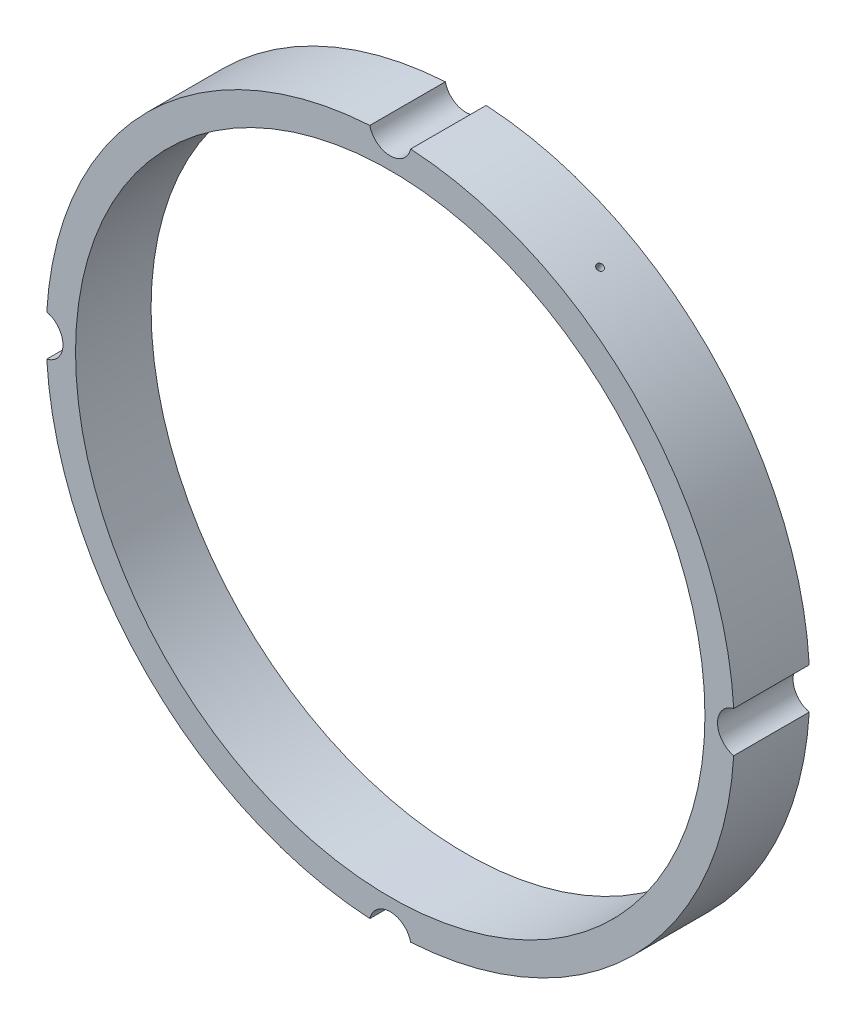
ISO-10303-21;
HEADER;
FILE_DESCRIPTION(('STEP AP214'),'2;1');
FILE_NAME('part.step','',(''),(''),'','','');
FILE_SCHEMA(('AUTOMOTIVE_DESIGN { 1 0 10303 214 1 1 1 1 }'));
ENDSEC;
DATA;
#1=APPLICATION_CONTEXT('core data for automotive mechanical design processes');
#2=APPLICATION_PROTOCOL_DEFINITION('international standard','automotive_design',2000,#1);
#3=PRODUCT_CONTEXT('',#1,'mechanical');
#4=PRODUCT('Part','Part','',(#3));
#5=PRODUCT_RELATED_PRODUCT_CATEGORY('part','',(#4));
#6=PRODUCT_DEFINITION_FORMATION('','',#4);
#7=PRODUCT_DEFINITION_CONTEXT('part definition',#1,'design');
#8=PRODUCT_DEFINITION('design','',#6,#7);
#9=PRODUCT_DEFINITION_SHAPE('','',#8);
#10=(LENGTH_UNIT() NAMED_UNIT(*) SI_UNIT(.MILLI.,.METRE.));
#11=(NAMED_UNIT(*) PLANE_ANGLE_UNIT() SI_UNIT($,.RADIAN.));
#12=(NAMED_UNIT(*) SI_UNIT($,.STERADIAN.) SOLID_ANGLE_UNIT());
#13=UNCERTAINTY_MEASURE_WITH_UNIT(LENGTH_MEASURE(1.E-05),#10,'distance_accuracy_value','');
#14=(GEOMETRIC_REPRESENTATION_CONTEXT(3) GLOBAL_UNCERTAINTY_ASSIGNED_CONTEXT((#13)) GLOBAL_UNIT_ASSIGNED_CONTEXT((#10,
#11,#12)) REPRESENTATION_CONTEXT('',''));
#15=CARTESIAN_POINT('',(0.,0.,0.));
#16=DIRECTION('',(0.,0.,1.));
#17=DIRECTION('',(1.,0.,0.));
#18=AXIS2_PLACEMENT_3D('',#15,#16,#17);
#19=CARTESIAN_POINT('',(0.,0.,18.));
#20=DIRECTION('',(0.,0.,-1.));
#21=DIRECTION('',(-1.,0.,0.));
#22=AXIS2_PLACEMENT_3D('',#19,#20,#21);
#23=CYLINDRICAL_SURFACE('',#22,82.);
#24=CARTESIAN_POINT('',(0.,0.,0.));
#25=DIRECTION('',(0.,0.,1.));
#26=DIRECTION('',(1.,0.,0.));
#27=AXIS2_PLACEMENT_3D('',#24,#25,#26);
#28=CIRCLE('',#27,82.);
#29=CARTESIAN_POINT('',(-4.86723129559619,81.855421686747,0.));
#30=VERTEX_POINT('',#29);
#31=CARTESIAN_POINT('',(-81.8554216867469,4.86723129559705,0.));
#32=VERTEX_POINT('',#31);
#33=EDGE_CURVE('E123',#30,#32,#28,.T.);
#34=ORIENTED_EDGE('',*,*,#33,.T.);
#35=DIRECTION('',(0.,0.,1.));
#36=VECTOR('',#35,1.);
#37=CARTESIAN_POINT('',(-81.8554216867469,4.86723129559704,9.));
#38=LINE('',#37,#36);
#39=CARTESIAN_POINT('',(-81.8554216867469,4.86723129559704,18.));
#40=VERTEX_POINT('',#39);
#41=EDGE_CURVE('E56',#32,#40,#38,.T.);
#42=ORIENTED_EDGE('',*,*,#41,.T.);
#43=CARTESIAN_POINT('',(0.,0.,18.));
#44=DIRECTION('',(0.,0.,1.));
#45=DIRECTION('',(1.,0.,0.));
#46=AXIS2_PLACEMENT_3D('',#43,#44,#45);
#47=CIRCLE('',#46,82.);
#48=CARTESIAN_POINT('',(-4.86723129559619,81.855421686747,18.));
#49=VERTEX_POINT('',#48);
#50=EDGE_CURVE('E130',#49,#40,#47,.T.);
#51=ORIENTED_EDGE('',*,*,#50,.F.);
#52=DIRECTION('',(0.,0.,1.));
#53=VECTOR('',#52,1.);
#54=CARTESIAN_POINT('',(-4.86723129559619,81.855421686747,9.));
#55=LINE('',#54,#53);
#56=EDGE_CURVE('E132',#49,#30,#55,.F.);
#57=ORIENTED_EDGE('',*,*,#56,.T.);
#58=EDGE_LOOP('',(#34,#42,#51,#57));
#59=FACE_BOUND('',#58,.T.);
#60=ADVANCED_FACE('F37',(#59),#23,.T.);
#61=CARTESIAN_POINT('',(-81.8554216867471,-4.86723129559533,18.));
#62=VERTEX_POINT('',#61);
#63=CARTESIAN_POINT('',(-4.86723129559619,-81.855421686747,18.));
#64=VERTEX_POINT('',#63);
#65=EDGE_CURVE('E116',#62,#64,#47,.T.);
#66=ORIENTED_EDGE('',*,*,#65,.F.);
#67=DIRECTION('',(0.,0.,1.));
#68=VECTOR('',#67,1.);
#69=CARTESIAN_POINT('',(-81.8554216867471,-4.86723129559533,9.));
#70=LINE('',#69,#68);
#71=CARTESIAN_POINT('',(-81.8554216867471,-4.86723129559533,0.));
#72=VERTEX_POINT('',#71);
#73=EDGE_CURVE('E107',#62,#72,#70,.F.);
#74=ORIENTED_EDGE('',*,*,#73,.T.);
#75=CARTESIAN_POINT('',(-4.86723129559619,-81.855421686747,0.));
#76=VERTEX_POINT('',#75);
#77=EDGE_CURVE('E64',#72,#76,#28,.T.);
#78=ORIENTED_EDGE('',*,*,#77,.T.);
#79=DIRECTION('',(0.,0.,1.));
#80=VECTOR('',#79,1.);
#81=CARTESIAN_POINT('',(-4.86723129559619,-81.855421686747,9.));
#82=LINE('',#81,#80);
#83=EDGE_CURVE('E161',#76,#64,#82,.T.);
#84=ORIENTED_EDGE('',*,*,#83,.T.);
#85=EDGE_LOOP('',(#66,#74,#78,#84));
#86=FACE_BOUND('',#85,.T.);
#87=ADVANCED_FACE('F115',(#86),#23,.T.);
#88=CARTESIAN_POINT('',(4.86723129559619,-81.855421686747,18.));
#89=VERTEX_POINT('',#88);
#90=CARTESIAN_POINT('',(81.855421686747,-4.86723129559647,18.));
#91=VERTEX_POINT('',#90);
#92=EDGE_CURVE('E146',#89,#91,#47,.T.);
#93=ORIENTED_EDGE('',*,*,#92,.F.);
#94=DIRECTION('',(0.,0.,1.));
#95=VECTOR('',#94,1.);
#96=CARTESIAN_POINT('',(4.86723129559619,-81.855421686747,9.));
#97=LINE('',#96,#95);
#98=CARTESIAN_POINT('',(4.86723129559619,-81.855421686747,0.));
#99=VERTEX_POINT('',#98);
#100=EDGE_CURVE('E214',#89,#99,#97,.F.);
#101=ORIENTED_EDGE('',*,*,#100,.T.);
#102=CARTESIAN_POINT('',(81.855421686747,-4.86723129559647,0.));
#103=VERTEX_POINT('',#102);
#104=EDGE_CURVE('E124',#99,#103,#28,.T.);
#105=ORIENTED_EDGE('',*,*,#104,.T.);
#106=DIRECTION('',(0.,0.,1.));
#107=VECTOR('',#106,1.);
#108=CARTESIAN_POINT('',(81.855421686747,-4.86723129559647,9.));
#109=LINE('',#108,#107);
#110=EDGE_CURVE('E49',#103,#91,#109,.T.);
#111=ORIENTED_EDGE('',*,*,#110,.T.);
#112=EDGE_LOOP('',(#93,#101,#105,#111));
#113=FACE_BOUND('',#112,.T.);
#114=ADVANCED_FACE('F144',(#113),#23,.T.);
#115=CARTESIAN_POINT('',(0.,0.,18.));
#116=DIRECTION('',(0.,0.,1.));
#117=DIRECTION('',(1.,0.,0.));
#118=AXIS2_PLACEMENT_3D('',#115,#116,#117);
#119=PLANE('',#118);
#120=CARTESIAN_POINT('',(-83.,8.6937885337194E-13,18.));
#121=DIRECTION('',(0.,0.,1.));
#122=DIRECTION('',(0.,1.,0.));
#123=AXIS2_PLACEMENT_3D('',#120,#121,#122);
#124=CIRCLE('',#123,5.);
#125=EDGE_CURVE('E112',#62,#40,#124,.T.);
#126=ORIENTED_EDGE('',*,*,#125,.F.);
#127=ORIENTED_EDGE('',*,*,#65,.T.);
#128=CARTESIAN_POINT('',(0.,-83.,18.));
#129=DIRECTION('',(0.,0.,1.));
#130=DIRECTION('',(-1.,0.,0.));
#131=AXIS2_PLACEMENT_3D('',#128,#129,#130);
#132=CIRCLE('',#131,5.);
#133=EDGE_CURVE('E206',#89,#64,#132,.T.);
#134=ORIENTED_EDGE('',*,*,#133,.F.);
#135=ORIENTED_EDGE('',*,*,#92,.T.);
#136=CARTESIAN_POINT('',(83.,-2.8979295112398E-13,18.));
#137=DIRECTION('',(0.,0.,1.));
#138=DIRECTION('',(0.,-1.,0.));
#139=AXIS2_PLACEMENT_3D('',#136,#137,#138);
#140=CIRCLE('',#139,5.);
#141=CARTESIAN_POINT('',(81.855421686747,4.8672312955959,18.));
#142=VERTEX_POINT('',#141);
#143=EDGE_CURVE('E153',#142,#91,#140,.T.);
#144=ORIENTED_EDGE('',*,*,#143,.F.);
#145=CARTESIAN_POINT('',(4.86723129559619,81.855421686747,18.));
#146=VERTEX_POINT('',#145);
#147=EDGE_CURVE('E126',#142,#146,#47,.T.);
#148=ORIENTED_EDGE('',*,*,#147,.T.);
#149=CARTESIAN_POINT('',(0.,83.,18.));
#150=DIRECTION('',(0.,0.,1.));
#151=DIRECTION('',(1.,0.,0.));
#152=AXIS2_PLACEMENT_3D('',#149,#150,#151);
#153=CIRCLE('',#152,5.);
#154=EDGE_CURVE('E156',#49,#146,#153,.T.);
#155=ORIENTED_EDGE('',*,*,#154,.F.);
#156=ORIENTED_EDGE('',*,*,#50,.T.);
#157=EDGE_LOOP('',(#126,#127,#134,#135,#144,#148,#155,#156));
#158=FACE_BOUND('',#157,.T.);
#159=CARTESIAN_POINT('',(0.,0.,18.));
#160=DIRECTION('',(0.,0.,1.));
#161=DIRECTION('',(1.,0.,0.));
#162=AXIS2_PLACEMENT_3D('',#159,#160,#161);
#163=CIRCLE('',#162,75.);
#164=CARTESIAN_POINT('',(75.,0.,18.));
#165=VERTEX_POINT('',#164);
#166=EDGE_CURVE('E168',#165,#165,#163,.T.);
#167=ORIENTED_EDGE('',*,*,#166,.F.);
#168=EDGE_LOOP('',(#167));
#169=FACE_BOUND('',#168,.T.);
#170=ADVANCED_FACE('F202',(#158,#169),#119,.T.);
#171=CARTESIAN_POINT('',(0.,0.,0.));
#172=DIRECTION('',(0.,0.,1.));
#173=DIRECTION('',(1.,0.,0.));
#174=AXIS2_PLACEMENT_3D('',#171,#172,#173);
#175=PLANE('',#174);
#176=ORIENTED_EDGE('',*,*,#77,.F.);
#177=CARTESIAN_POINT('',(-83.,8.6937885337194E-13,0.));
#178=DIRECTION('',(0.,0.,1.));
#179=DIRECTION('',(0.,1.,0.));
#180=AXIS2_PLACEMENT_3D('',#177,#178,#179);
#181=CIRCLE('',#180,5.);
#182=EDGE_CURVE('E105',#72,#32,#181,.T.);
#183=ORIENTED_EDGE('',*,*,#182,.T.);
#184=ORIENTED_EDGE('',*,*,#33,.F.);
#185=CARTESIAN_POINT('',(0.,83.,0.));
#186=DIRECTION('',(0.,0.,1.));
#187=DIRECTION('',(1.,0.,0.));
#188=AXIS2_PLACEMENT_3D('',#185,#186,#187);
#189=CIRCLE('',#188,5.);
#190=CARTESIAN_POINT('',(4.86723129559619,81.855421686747,0.));
#191=VERTEX_POINT('',#190);
#192=EDGE_CURVE('E159',#30,#191,#189,.T.);
#193=ORIENTED_EDGE('',*,*,#192,.T.);
#194=CARTESIAN_POINT('',(81.855421686747,4.8672312955959,0.));
#195=VERTEX_POINT('',#194);
#196=EDGE_CURVE('E127',#195,#191,#28,.T.);
#197=ORIENTED_EDGE('',*,*,#196,.F.);
#198=CARTESIAN_POINT('',(83.,-2.8979295112398E-13,0.));
#199=DIRECTION('',(0.,0.,1.));
#200=DIRECTION('',(0.,-1.,0.));
#201=AXIS2_PLACEMENT_3D('',#198,#199,#200);
#202=CIRCLE('',#201,5.);
#203=EDGE_CURVE('E151',#195,#103,#202,.T.);
#204=ORIENTED_EDGE('',*,*,#203,.T.);
#205=ORIENTED_EDGE('',*,*,#104,.F.);
#206=CARTESIAN_POINT('',(0.,-83.,0.));
#207=DIRECTION('',(0.,0.,1.));
#208=DIRECTION('',(-1.,0.,0.));
#209=AXIS2_PLACEMENT_3D('',#206,#207,#208);
#210=CIRCLE('',#209,5.);
#211=EDGE_CURVE('E122',#99,#76,#210,.T.);
#212=ORIENTED_EDGE('',*,*,#211,.T.);
#213=EDGE_LOOP('',(#176,#183,#184,#193,#197,#204,#205,#212));
#214=FACE_BOUND('',#213,.T.);
#215=CARTESIAN_POINT('',(0.,0.,0.));
#216=DIRECTION('',(0.,0.,1.));
#217=DIRECTION('',(1.,0.,0.));
#218=AXIS2_PLACEMENT_3D('',#215,#216,#217);
#219=CIRCLE('',#218,75.);
#220=CARTESIAN_POINT('',(75.,0.,0.));
#221=VERTEX_POINT('',#220);
#222=EDGE_CURVE('E166',#221,#221,#219,.T.);
#223=ORIENTED_EDGE('',*,*,#222,.T.);
#224=EDGE_LOOP('',(#223));
#225=FACE_BOUND('',#224,.T.);
#226=ADVANCED_FACE('F119',(#214,#225),#175,.F.);
#227=CARTESIAN_POINT('',(40.3052284110281,71.4107034185693,9.));
#228=CARTESIAN_POINT('',(40.305230162785,71.4107024681233,8.95506479609301));
#229=CARTESIAN_POINT('',(40.3085368078791,71.40883642493,8.91009703714874));
#230=CARTESIAN_POINT('',(40.3216802135916,71.4014156688339,8.82140003350558));
#231=CARTESIAN_POINT('',(40.3315248278901,71.3958565196163,8.7776723443821));
#232=CARTESIAN_POINT('',(40.3574592527584,71.3811999286591,8.69275330768963));
#233=CARTESIAN_POINT('',(40.3735460727166,71.3721041812829,8.65156075648079));
#234=CARTESIAN_POINT('',(40.4114971299767,71.3506227921757,8.57287429083478));
#235=CARTESIAN_POINT('',(40.4333599334488,71.3382379669211,8.53537946164327));
#236=CARTESIAN_POINT('',(40.4822388609424,71.3105120161913,8.4651344354136));
#237=CARTESIAN_POINT('',(40.5092556770344,71.2951704936937,8.43238487660122));
#238=CARTESIAN_POINT('',(40.5676657214676,71.2619507473826,8.37256517048709));
#239=CARTESIAN_POINT('',(40.59905912185,71.2440724238483,8.34549524655357));
#240=CARTESIAN_POINT('',(40.6653214679689,71.2062713712898,8.29780471692709));
#241=CARTESIAN_POINT('',(40.7001904182244,71.1863486396075,8.27718411961991));
#242=CARTESIAN_POINT('',(40.772406334745,71.1450111456782,8.24297779787522));
#243=CARTESIAN_POINT('',(40.8097532955037,71.1235963867468,8.22939205780614));
#244=CARTESIAN_POINT('',(40.8858585322044,71.0798740635081,8.20964144378451));
#245=CARTESIAN_POINT('',(40.9246167652487,71.0575665263361,8.20347634446412));
#246=CARTESIAN_POINT('',(41.0024427076472,71.0126869615936,8.19874133559804));
#247=CARTESIAN_POINT('',(41.0415104163721,70.9901149345609,8.20017141060814));
#248=CARTESIAN_POINT('',(41.1188455717403,70.945348935138,8.21058592631372));
#249=CARTESIAN_POINT('',(41.1571130452983,70.9231549500377,8.21957011251892));
#250=CARTESIAN_POINT('',(41.2317665366884,70.8797805669154,8.2448374350582));
#251=CARTESIAN_POINT('',(41.2681525523058,70.8586001700864,8.26112057998316));
#252=CARTESIAN_POINT('',(41.3380172194721,70.8178647619419,8.30052388209611));
#253=CARTESIAN_POINT('',(41.3714958216182,70.7983097782456,8.32364415543102));
#254=CARTESIAN_POINT('',(41.434603016724,70.7613949232539,8.37606530348475));
#255=CARTESIAN_POINT('',(41.4642316101463,70.7440350516948,8.40536617746083));
#256=CARTESIAN_POINT('',(41.5188083007378,70.7120185025764,8.4693182281911));
#257=CARTESIAN_POINT('',(41.5437562021976,70.6973619380483,8.50396962855131));
#258=CARTESIAN_POINT('',(41.5882710512857,70.6711849340483,8.57763829735254));
#259=CARTESIAN_POINT('',(41.6078379981956,70.6596644949952,8.61665556637643));
#260=CARTESIAN_POINT('',(41.641043626485,70.640100926749,8.69794850712354));
#261=CARTESIAN_POINT('',(41.6546823022913,70.6320578008251,8.74022418191001));
#262=CARTESIAN_POINT('',(41.6756502729947,70.6196879331484,8.8268337992777));
#263=CARTESIAN_POINT('',(41.6829795699621,70.6153611901761,8.87116774118354));
#264=CARTESIAN_POINT('',(41.6911239668386,70.6105530728755,8.96063342804992));
#265=CARTESIAN_POINT('',(41.6919393353669,70.6100715399797,9.00576514003536));
#266=CARTESIAN_POINT('',(41.6870338226723,70.6129677812092,9.09554693556317));
#267=CARTESIAN_POINT('',(41.6813129419862,70.6163455550177,9.14019701914508));
#268=CARTESIAN_POINT('',(41.6634948178797,70.6268596602105,9.22774720890134));
#269=CARTESIAN_POINT('',(41.6513976958952,70.6339959200141,9.27064734838672));
#270=CARTESIAN_POINT('',(41.6211650638207,70.6518147314161,9.3534808607507));
#271=CARTESIAN_POINT('',(41.6030295531477,70.6624972833568,9.39341423334282));
#272=CARTESIAN_POINT('',(41.5612265203059,70.6870924286367,9.46918206255699));
#273=CARTESIAN_POINT('',(41.537558817141,70.7010051276562,9.50501638501377));
#274=CARTESIAN_POINT('',(41.4853544455829,70.7316497769729,9.57156755198845));
#275=CARTESIAN_POINT('',(41.4568177741148,70.7483817290505,9.60228439327472));
#276=CARTESIAN_POINT('',(41.3956750206665,70.7841743762166,9.65772966893016));
#277=CARTESIAN_POINT('',(41.3630688010143,70.8032351500882,9.68245790062276));
#278=CARTESIAN_POINT('',(41.2947046718655,70.8431290267123,9.72522259144113));
#279=CARTESIAN_POINT('',(41.2589467660966,70.8639621273686,9.74325905848161));
#280=CARTESIAN_POINT('',(41.1852880913143,70.9067969831621,9.77212789441348));
#281=CARTESIAN_POINT('',(41.1473873619883,70.9287987166545,9.7829603966825));
#282=CARTESIAN_POINT('',(41.0705139344065,70.9733390629306,9.79711425167829));
#283=CARTESIAN_POINT('',(41.0315412345227,70.9958776765296,9.80043559299621));
#284=CARTESIAN_POINT('',(40.9536306752187,71.0408485140235,9.79947279646204));
#285=CARTESIAN_POINT('',(40.9146928143604,71.0632807424909,9.7951889885238));
#286=CARTESIAN_POINT('',(40.8379572703114,71.1074061241529,9.779138152379));
#287=CARTESIAN_POINT('',(40.8001595894107,71.129099275863,9.76737110914375));
#288=CARTESIAN_POINT('',(40.7267814451327,71.1711392536284,9.73668763250791));
#289=CARTESIAN_POINT('',(40.6912010228659,71.1914860547211,9.71777106659268));
#290=CARTESIAN_POINT('',(40.6232765406942,71.2302669838026,9.67332635454546));
#291=CARTESIAN_POINT('',(40.5909323548439,71.2487011862253,9.64779846584659));
#292=CARTESIAN_POINT('',(40.5304074104666,71.2831487094411,9.59085755066491));
#293=CARTESIAN_POINT('',(40.5022263893502,71.2991621829217,9.55944489564427));
#294=CARTESIAN_POINT('',(40.4508278504761,71.328335198352,9.49161477008843));
#295=CARTESIAN_POINT('',(40.4276115676375,71.3414940302556,9.45519605804872));
#296=CARTESIAN_POINT('',(40.3868099222115,71.3646000206399,9.37838044791628));
#297=CARTESIAN_POINT('',(40.3692273551643,71.3745455846659,9.33798158776967));
#298=CARTESIAN_POINT('',(40.340231691055,71.3909377104108,9.25439747070503));
#299=CARTESIAN_POINT('',(40.3288112020707,71.3973884644812,9.21121562216788));
#300=CARTESIAN_POINT('',(40.3155112248783,71.4048988976244,9.13979902324665));
#301=CARTESIAN_POINT('',(40.3116600520628,71.4070729879977,9.11202827082364));
#302=CARTESIAN_POINT('',(40.3065180975612,71.4099755455663,9.05617592082971));
#303=CARTESIAN_POINT('',(40.3052273157971,71.4107040128057,9.02809432326828));
#304=CARTESIAN_POINT('',(40.3052284110281,71.4107034185693,9.));
#305=B_SPLINE_CURVE_WITH_KNOTS('',3,(#227,#228,#229,#230,#231,#232,#233,#234,#235,#236,#237,
#238,#239,#240,#241,#242,#243,#244,#245,#246,#247,#248,#249,#250,#251,#252,#253,#254,#255,#256,
#257,#258,#259,#260,#261,#262,#263,#264,#265,#266,#267,#268,#269,#270,#271,#272,#273,#274,#275,
#276,#277,#278,#279,#280,#281,#282,#283,#284,#285,#286,#287,#288,#289,#290,#291,#292,#293,#294,
#295,#296,#297,#298,#299,#300,#301,#302,#303,#304),.UNSPECIFIED.,.T.,.F.,(4,2,2,2,2,2,2,2,2,2,2,
2,2,2,2,2,2,2,2,2,2,2,2,2,2,2,2,2,2,2,2,2,2,2,2,2,2,2,4),(0.,0.134703067123949,
0.269568238553243,0.404368876326958,0.539136082591844,0.673921397882173,0.808712013005295,
0.94350280339,1.07829329426615,1.21307969139774,1.3478658144514,1.4826473968801,
1.61742913794746,1.75221316877516,1.88699718340582,2.02178683237555,2.15657649934034,
2.29136629302324,2.426156042478,2.56094023348925,2.69572441343266,2.83050602649563,
2.9652876525739,3.10007368890393,3.23485981034963,3.36965049281604,3.50444101585779,
3.639229043254,3.77401727538222,3.90879966049609,4.04358231629638,4.17836747038269,
4.31314737696436,4.44791877874286,4.58272366439784,4.71759533917825,4.85230486249334,
4.93652372208243,5.02074257910246),.UNSPECIFIED.);
#306=CARTESIAN_POINT('',(40.3052284110281,71.4107034185693,9.));
#307=VERTEX_POINT('',#306);
#308=EDGE_CURVE('E11',#307,#307,#305,.T.);
#309=ORIENTED_EDGE('',*,*,#308,.T.);
#310=EDGE_LOOP('',(#309));
#311=FACE_BOUND('',#310,.T.);
#312=ORIENTED_EDGE('',*,*,#147,.F.);
#313=DIRECTION('',(0.,0.,1.));
#314=VECTOR('',#313,1.);
#315=CARTESIAN_POINT('',(81.855421686747,4.8672312955959,9.));
#316=LINE('',#315,#314);
#317=EDGE_CURVE('E138',#142,#195,#316,.F.);
#318=ORIENTED_EDGE('',*,*,#317,.T.);
#319=ORIENTED_EDGE('',*,*,#196,.T.);
#320=DIRECTION('',(0.,0.,1.));
#321=VECTOR('',#320,1.);
#322=CARTESIAN_POINT('',(4.86723129559619,81.855421686747,9.));
#323=LINE('',#322,#321);
#324=EDGE_CURVE('E135',#191,#146,#323,.T.);
#325=ORIENTED_EDGE('',*,*,#324,.T.);
#326=EDGE_LOOP('',(#312,#318,#319,#325));
#327=FACE_BOUND('',#326,.T.);
#328=ADVANCED_FACE('F39',(#311,#327),#23,.T.);
#329=CARTESIAN_POINT('',(0.,0.,18.));
#330=DIRECTION('',(0.,0.,-1.));
#331=DIRECTION('',(-1.,0.,0.));
#332=AXIS2_PLACEMENT_3D('',#329,#330,#331);
#333=CYLINDRICAL_SURFACE('',#332,75.);
#334=CARTESIAN_POINT('',(36.8050462829542,65.3482101370007,9.));
#335=CARTESIAN_POINT('',(36.8050480371068,65.3482091908556,8.9550650202504));
#336=CARTESIAN_POINT('',(36.8083563893281,65.3463461799556,8.91009749094246));
#337=CARTESIAN_POINT('',(36.8215064307599,65.3389372344705,8.82140095562176));
#338=CARTESIAN_POINT('',(36.8313559762903,65.3333868711768,8.77767350494019));
#339=CARTESIAN_POINT('',(36.8573029001601,65.3187526175866,8.69275494634586));
#340=CARTESIAN_POINT('',(36.8733972851322,65.3096704202157,8.65156263419737));
#341=CARTESIAN_POINT('',(36.9113652327449,65.2882193796654,8.57287659923403));
#342=CARTESIAN_POINT('',(36.9332373616623,65.275851351847,8.535381962022));
#343=CARTESIAN_POINT('',(36.9821357786632,65.2481602840425,8.46513702906338));
#344=CARTESIAN_POINT('',(37.0091627888349,65.2328368300614,8.43238739912278));
#345=CARTESIAN_POINT('',(37.0675928290538,65.1996525164563,8.37256749931847));
#346=CARTESIAN_POINT('',(37.0989960311762,65.1817915570551,8.34549745288538));
#347=CARTESIAN_POINT('',(37.165276621277,65.1440224914367,8.29780653018475));
#348=CARTESIAN_POINT('',(37.2001540272983,65.1241143745878,8.27718568741294));
#349=CARTESIAN_POINT('',(37.2723844475244,65.0828017747338,8.24297889347224));
#350=CARTESIAN_POINT('',(37.309737456126,65.0613972951156,8.22939292638149));
#351=CARTESIAN_POINT('',(37.3858514560471,65.0176901750221,8.20964196631049));
#352=CARTESIAN_POINT('',(37.4246123956757,64.9953875675174,8.20347670116969));
#353=CARTESIAN_POINT('',(37.5024403148383,64.9505118372576,8.19874132894007));
#354=CARTESIAN_POINT('',(37.541507293736,64.9279387150649,8.20017120606366));
#355=CARTESIAN_POINT('',(37.6188373554944,64.8831647861721,8.21058526118988));
#356=CARTESIAN_POINT('',(37.6571004707224,64.8609639644887,8.21956913443268));
#357=CARTESIAN_POINT('',(37.7317423544195,64.8175707954564,8.24483569725782));
#358=CARTESIAN_POINT('',(37.7681211206258,64.7963784493184,8.26111839560382));
#359=CARTESIAN_POINT('',(37.8379693340923,64.7556153066755,8.30052074156641));
#360=CARTESIAN_POINT('',(37.8714387220741,64.7360445432105,8.32364052844562));
#361=CARTESIAN_POINT('',(37.934526459754,64.6990961367939,8.37606063773741));
#362=CARTESIAN_POINT('',(37.9641448097006,64.6817184937006,8.40536095975093));
#363=CARTESIAN_POINT('',(38.0187013917973,64.6496662631315,8.46931214094039));
#364=CARTESIAN_POINT('',(38.0436393901331,64.6349918106984,8.50396326726653));
#365=CARTESIAN_POINT('',(38.0881356631969,64.6087810653332,8.57763147675293));
#366=CARTESIAN_POINT('',(38.1076939372037,64.597244772822,8.61664856049856));
#367=CARTESIAN_POINT('',(38.1408844541449,64.5776533045459,8.69794124937334));
#368=CARTESIAN_POINT('',(38.1545166903565,64.5695981327303,8.74021685819908));
#369=CARTESIAN_POINT('',(38.1754747513236,64.5572093338679,8.82682645392058));
#370=CARTESIAN_POINT('',(38.1828005784973,64.5528757053942,8.87116044002704));
#371=CARTESIAN_POINT('',(38.1909413824111,64.5480597632868,8.96062594210085));
#372=CARTESIAN_POINT('',(38.1917566800836,64.5475772598144,9.00575741864649));
#373=CARTESIAN_POINT('',(38.1868545475179,64.5504775161813,9.09553881341012));
#374=CARTESIAN_POINT('',(38.1811371179785,64.5538602756073,9.14018873167963));
#375=CARTESIAN_POINT('',(38.1633291083601,64.5643896994272,9.22773849669129));
#376=CARTESIAN_POINT('',(38.1512386734367,64.5715362780939,9.27063838326933));
#377=CARTESIAN_POINT('',(38.121021943817,64.58937987047,9.35347150366394));
#378=CARTESIAN_POINT('',(38.1028956482698,64.6000768846797,9.39340473706235));
#379=CARTESIAN_POINT('',(38.0611124544012,64.6247035165116,9.46917268708774));
#380=CARTESIAN_POINT('',(38.0374553396379,64.6386332606425,9.50500724323626));
#381=CARTESIAN_POINT('',(37.9852724588776,64.6693125821188,9.57155900623288));
#382=CARTESIAN_POINT('',(37.9567466895903,64.6860621613697,9.60227620962269));
#383=CARTESIAN_POINT('',(37.8956246465006,64.7218887639564,9.6577225312695));
#384=CARTESIAN_POINT('',(37.863028208343,64.7409658812668,9.6824514076266));
#385=CARTESIAN_POINT('',(37.7946816007971,64.7808892105927,9.72521742401462));
#386=CARTESIAN_POINT('',(37.7589314352171,64.8017354204719,9.7432545721263));
#387=CARTESIAN_POINT('',(37.6852854659991,64.8445917012878,9.77212471767835));
#388=CARTESIAN_POINT('',(37.6473897097049,64.8666017465431,9.78295787401225));
#389=CARTESIAN_POINT('',(37.570522798859,64.9111530416104,9.79711304961451));
#390=CARTESIAN_POINT('',(37.5315516427333,64.9336942922,9.80043505788946));
#391=CARTESIAN_POINT('',(37.4536409057876,64.9786642363913,9.79947358692461));
#392=CARTESIAN_POINT('',(37.4147013234452,65.0010929357281,9.79519049922343));
#393=CARTESIAN_POINT('',(37.3379589704716,65.0452056620496,9.77914120179627));
#394=CARTESIAN_POINT('',(37.3001562021231,65.0668896875391,9.76737497704568));
#395=CARTESIAN_POINT('',(37.2267650922114,65.1089068431069,9.73669322600969));
#396=CARTESIAN_POINT('',(37.1911767916611,65.1292399481661,9.71777756735918));
#397=CARTESIAN_POINT('',(37.1232346218809,65.1679904761977,9.67333473728467));
#398=CARTESIAN_POINT('',(37.0908806269882,65.1864079735984,9.64780782286669));
#399=CARTESIAN_POINT('',(37.0303349483126,65.2208211267837,9.59086865031062));
#400=CARTESIAN_POINT('',(37.0021430357465,65.236816915687,9.55945671587822));
#401=CARTESIAN_POINT('',(36.9507230753817,65.2659554454819,9.49162792346797));
#402=CARTESIAN_POINT('',(36.9274962624952,65.2790974766038,9.45520982405611));
#403=CARTESIAN_POINT('',(36.886674973326,65.3021727146869,9.37839515111328));
#404=CARTESIAN_POINT('',(36.8690833131314,65.3121043173042,9.3379966015531));
#405=CARTESIAN_POINT('',(36.8400719807352,65.3284729390554,9.25441290469288));
#406=CARTESIAN_POINT('',(36.8286449144051,65.3349141447912,9.21123116563502));
#407=CARTESIAN_POINT('',(36.8153363830033,65.3424137824977,9.13981210935175));
#408=CARTESIAN_POINT('',(36.8114824882576,65.3445848245014,9.11203879602761));
#409=CARTESIAN_POINT('',(36.8063368898609,65.3474832975298,9.05618123049376));
#410=CARTESIAN_POINT('',(36.8050451861163,65.3482107286071,9.02809697829541));
#411=CARTESIAN_POINT('',(36.8050462829542,65.3482101370007,9.));
#412=B_SPLINE_CURVE_WITH_KNOTS('',3,(#334,#335,#336,#337,#338,#339,#340,#341,#342,#343,#344,
#345,#346,#347,#348,#349,#350,#351,#352,#353,#354,#355,#356,#357,#358,#359,#360,#361,#362,#363,
#364,#365,#366,#367,#368,#369,#370,#371,#372,#373,#374,#375,#376,#377,#378,#379,#380,#381,#382,
#383,#384,#385,#386,#387,#388,#389,#390,#391,#392,#393,#394,#395,#396,#397,#398,#399,#400,#401,
#402,#403,#404,#405,#406,#407,#408,#409,#410,#411),.UNSPECIFIED.,.T.,.F.,(4,2,2,2,2,2,2,2,2,2,2,
2,2,2,2,2,2,2,2,2,2,2,2,2,2,2,2,2,2,2,2,2,2,2,2,2,2,2,4),(0.,0.134702384884244,
0.269566847771312,0.40436674516063,0.539133223883879,0.673918594382309,0.808709266243901,
0.943500638166865,1.07829170501872,1.21307782814302,1.34786367109516,1.48264407648282,
1.61742464370115,1.7522079564138,1.88699126042393,2.02178129595247,2.15657134955318,
2.29136155606753,2.42615171089689,2.56093522128892,2.69571871726381,2.83049914345483,
2.96527958864289,3.10006530918112,3.2348511208066,3.36964237622914,3.50443346888079,
3.63922158843893,3.7740099052748,3.9087912829084,4.04357293115624,4.17835707488293,
4.31313597979599,4.44790747336683,4.58271244820657,4.71758468521552,4.8522947878496,
4.93652160053771,5.02074841015293),.UNSPECIFIED.);
#413=CARTESIAN_POINT('',(36.8050462829542,65.3482101370007,9.));
#414=VERTEX_POINT('',#413);
#415=EDGE_CURVE('E207',#414,#414,#412,.T.);
#416=ORIENTED_EDGE('',*,*,#415,.F.);
#417=EDGE_LOOP('',(#416));
#418=FACE_BOUND('',#417,.T.);
#419=ORIENTED_EDGE('',*,*,#166,.T.);
#420=EDGE_LOOP('',(#419));
#421=FACE_BOUND('',#420,.T.);
#422=ORIENTED_EDGE('',*,*,#222,.F.);
#423=EDGE_LOOP('',(#422));
#424=FACE_BOUND('',#423,.T.);
#425=ADVANCED_FACE('F173',(#418,#421,#424),#333,.F.);
#426=CARTESIAN_POINT('',(0.,83.,0.));
#427=DIRECTION('',(0.,0.,1.));
#428=DIRECTION('',(1.,0.,0.));
#429=AXIS2_PLACEMENT_3D('',#426,#427,#428);
#430=CYLINDRICAL_SURFACE('',#429,5.);
#431=ORIENTED_EDGE('',*,*,#192,.F.);
#432=ORIENTED_EDGE('',*,*,#56,.F.);
#433=ORIENTED_EDGE('',*,*,#154,.T.);
#434=ORIENTED_EDGE('',*,*,#324,.F.);
#435=EDGE_LOOP('',(#431,#432,#433,#434));
#436=FACE_BOUND('',#435,.T.);
#437=ADVANCED_FACE('F175',(#436),#430,.F.);
#438=CARTESIAN_POINT('',(83.,-2.8979295112398E-13,0.));
#439=DIRECTION('',(0.,0.,1.));
#440=DIRECTION('',(1.,0.,0.));
#441=AXIS2_PLACEMENT_3D('',#438,#439,#440);
#442=CYLINDRICAL_SURFACE('',#441,5.);
#443=ORIENTED_EDGE('',*,*,#203,.F.);
#444=ORIENTED_EDGE('',*,*,#317,.F.);
#445=ORIENTED_EDGE('',*,*,#143,.T.);
#446=ORIENTED_EDGE('',*,*,#110,.F.);
#447=EDGE_LOOP('',(#443,#444,#445,#446));
#448=FACE_BOUND('',#447,.T.);
#449=ADVANCED_FACE('F150',(#448),#442,.F.);
#450=CARTESIAN_POINT('',(0.,-83.,0.));
#451=DIRECTION('',(0.,0.,1.));
#452=DIRECTION('',(1.,0.,0.));
#453=AXIS2_PLACEMENT_3D('',#450,#451,#452);
#454=CYLINDRICAL_SURFACE('',#453,5.);
#455=ORIENTED_EDGE('',*,*,#211,.F.);
#456=ORIENTED_EDGE('',*,*,#100,.F.);
#457=ORIENTED_EDGE('',*,*,#133,.T.);
#458=ORIENTED_EDGE('',*,*,#83,.F.);
#459=EDGE_LOOP('',(#455,#456,#457,#458));
#460=FACE_BOUND('',#459,.T.);
#461=ADVANCED_FACE('F216',(#460),#454,.F.);
#462=CARTESIAN_POINT('',(-83.,8.6937885337194E-13,0.));
#463=DIRECTION('',(0.,0.,1.));
#464=DIRECTION('',(1.,0.,0.));
#465=AXIS2_PLACEMENT_3D('',#462,#463,#464);
#466=CYLINDRICAL_SURFACE('',#465,5.);
#467=ORIENTED_EDGE('',*,*,#182,.F.);
#468=ORIENTED_EDGE('',*,*,#73,.F.);
#469=ORIENTED_EDGE('',*,*,#125,.T.);
#470=ORIENTED_EDGE('',*,*,#41,.F.);
#471=EDGE_LOOP('',(#467,#468,#469,#470));
#472=FACE_BOUND('',#471,.T.);
#473=ADVANCED_FACE('F106',(#472),#466,.F.);
#474=CARTESIAN_POINT('',(41.,71.014083110324,9.));
#475=DIRECTION('',(0.5,0.866025403784439,0.));
#476=DIRECTION('',(-0.866025403784439,0.5,0.));
#477=AXIS2_PLACEMENT_3D('',#474,#475,#476);
#478=CYLINDRICAL_SURFACE('',#477,0.799999999999989);
#479=ORIENTED_EDGE('',*,*,#415,.T.);
#480=EDGE_LOOP('',(#479));
#481=FACE_BOUND('',#480,.T.);
#482=ORIENTED_EDGE('',*,*,#308,.F.);
#483=EDGE_LOOP('',(#482));
#484=FACE_BOUND('',#483,.T.);
#485=ADVANCED_FACE('F223',(#481,#484),#478,.F.);
#486=CLOSED_SHELL('',(#60,#87,#114,#170,#226,#328,#425,#437,#449,#461,#473,#485));
#487=MANIFOLD_SOLID_BREP('B2',#486);
#488=ADVANCED_BREP_SHAPE_REPRESENTATION('',(#18,#487),#14);
#489=SHAPE_DEFINITION_REPRESENTATION(#9,#488);
ENDSEC;
END-ISO-10303-21;
